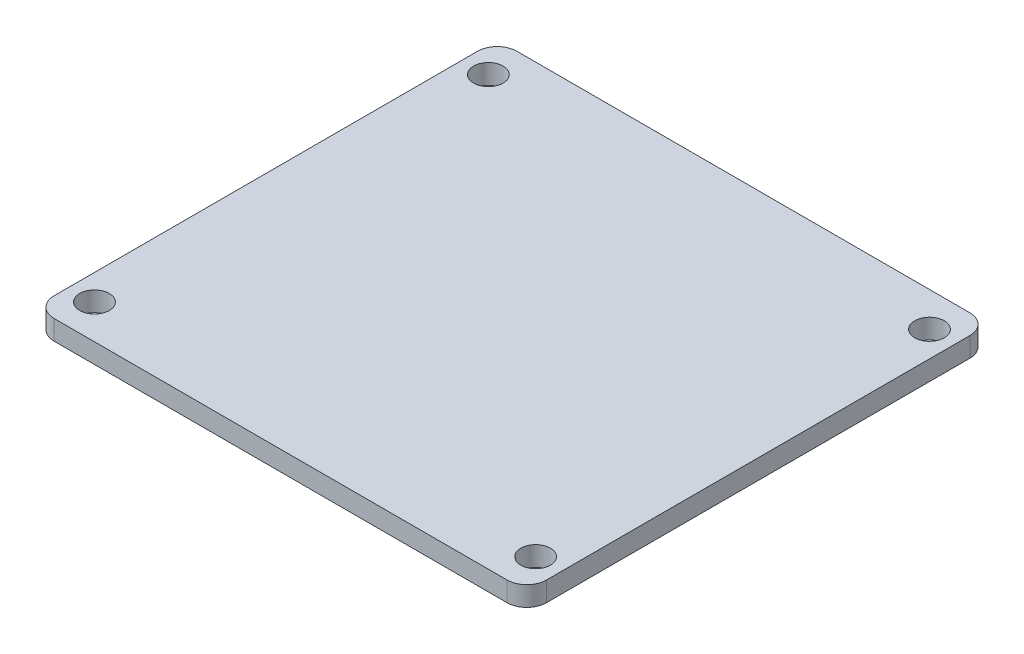
ISO-10303-21;
HEADER;
FILE_DESCRIPTION(('STEP AP214'),'2;1');
FILE_NAME('part.step','',(''),(''),'','','');
FILE_SCHEMA(('AUTOMOTIVE_DESIGN { 1 0 10303 214 1 1 1 1 }'));
ENDSEC;
DATA;
#1=APPLICATION_CONTEXT('core data for automotive mechanical design processes');
#2=APPLICATION_PROTOCOL_DEFINITION('international standard','automotive_design',2000,#1);
#3=PRODUCT_CONTEXT('',#1,'mechanical');
#4=PRODUCT('Part','Part','',(#3));
#5=PRODUCT_RELATED_PRODUCT_CATEGORY('part','',(#4));
#6=PRODUCT_DEFINITION_FORMATION('','',#4);
#7=PRODUCT_DEFINITION_CONTEXT('part definition',#1,'design');
#8=PRODUCT_DEFINITION('design','',#6,#7);
#9=PRODUCT_DEFINITION_SHAPE('','',#8);
#10=(LENGTH_UNIT() NAMED_UNIT(*) SI_UNIT(.MILLI.,.METRE.));
#11=(NAMED_UNIT(*) PLANE_ANGLE_UNIT() SI_UNIT($,.RADIAN.));
#12=(NAMED_UNIT(*) SI_UNIT($,.STERADIAN.) SOLID_ANGLE_UNIT());
#13=UNCERTAINTY_MEASURE_WITH_UNIT(LENGTH_MEASURE(1.E-05),#10,'distance_accuracy_value','');
#14=(GEOMETRIC_REPRESENTATION_CONTEXT(3) GLOBAL_UNCERTAINTY_ASSIGNED_CONTEXT((#13)) GLOBAL_UNIT_ASSIGNED_CONTEXT((#10,
#11,#12)) REPRESENTATION_CONTEXT('',''));
#15=CARTESIAN_POINT('',(0.,0.,0.));
#16=DIRECTION('',(0.,0.,1.));
#17=DIRECTION('',(1.,0.,0.));
#18=AXIS2_PLACEMENT_3D('',#15,#16,#17);
#19=CARTESIAN_POINT('',(0.,2.,0.));
#20=DIRECTION('',(0.,1.,0.));
#21=DIRECTION('',(0.,0.,1.));
#22=AXIS2_PLACEMENT_3D('',#19,#20,#21);
#23=PLANE('',#22);
#24=CARTESIAN_POINT('',(22.4,2.,20.));
#25=DIRECTION('',(0.,1.,0.));
#26=DIRECTION('',(0.,0.,1.));
#27=AXIS2_PLACEMENT_3D('',#24,#25,#26);
#28=CIRCLE('',#27,1.5);
#29=CARTESIAN_POINT('',(22.4,2.,21.5));
#30=VERTEX_POINT('',#29);
#31=EDGE_CURVE('E182',#30,#30,#28,.T.);
#32=ORIENTED_EDGE('',*,*,#31,.F.);
#33=EDGE_LOOP('',(#32));
#34=FACE_BOUND('',#33,.T.);
#35=CARTESIAN_POINT('',(-22.4,2.,-20.));
#36=DIRECTION('',(0.,1.,0.));
#37=DIRECTION('',(0.,0.,1.));
#38=AXIS2_PLACEMENT_3D('',#35,#36,#37);
#39=CIRCLE('',#38,1.5);
#40=CARTESIAN_POINT('',(-22.4,2.,-18.5));
#41=VERTEX_POINT('',#40);
#42=EDGE_CURVE('E165',#41,#41,#39,.T.);
#43=ORIENTED_EDGE('',*,*,#42,.F.);
#44=EDGE_LOOP('',(#43));
#45=FACE_BOUND('',#44,.T.);
#46=DIRECTION('',(0.,0.,1.));
#47=VECTOR('',#46,1.);
#48=CARTESIAN_POINT('',(-25.,2.,-23.5));
#49=LINE('',#48,#47);
#50=CARTESIAN_POINT('',(-25.,2.,-21.5));
#51=VERTEX_POINT('',#50);
#52=CARTESIAN_POINT('',(-25.,2.,21.5));
#53=VERTEX_POINT('',#52);
#54=EDGE_CURVE('E172',#51,#53,#49,.T.);
#55=ORIENTED_EDGE('',*,*,#54,.T.);
#56=CARTESIAN_POINT('',(-23.,2.,21.5));
#57=DIRECTION('',(0.,1.,0.));
#58=DIRECTION('',(0.,0.,1.));
#59=AXIS2_PLACEMENT_3D('',#56,#57,#58);
#60=CIRCLE('',#59,2.);
#61=CARTESIAN_POINT('',(-23.,2.,23.5));
#62=VERTEX_POINT('',#61);
#63=EDGE_CURVE('E149',#53,#62,#60,.T.);
#64=ORIENTED_EDGE('',*,*,#63,.T.);
#65=DIRECTION('',(1.,0.,0.));
#66=VECTOR('',#65,1.);
#67=CARTESIAN_POINT('',(-25.,2.,23.5));
#68=LINE('',#67,#66);
#69=CARTESIAN_POINT('',(23.,2.,23.5));
#70=VERTEX_POINT('',#69);
#71=EDGE_CURVE('E120',#62,#70,#68,.T.);
#72=ORIENTED_EDGE('',*,*,#71,.T.);
#73=CARTESIAN_POINT('',(23.,2.,21.5));
#74=DIRECTION('',(0.,1.,0.));
#75=DIRECTION('',(0.,0.,1.));
#76=AXIS2_PLACEMENT_3D('',#73,#74,#75);
#77=CIRCLE('',#76,2.);
#78=CARTESIAN_POINT('',(25.,2.,21.5));
#79=VERTEX_POINT('',#78);
#80=EDGE_CURVE('E144',#70,#79,#77,.T.);
#81=ORIENTED_EDGE('',*,*,#80,.T.);
#82=DIRECTION('',(0.,0.,-1.));
#83=VECTOR('',#82,1.);
#84=CARTESIAN_POINT('',(25.,2.,-23.5));
#85=LINE('',#84,#83);
#86=CARTESIAN_POINT('',(25.,2.,-21.5));
#87=VERTEX_POINT('',#86);
#88=EDGE_CURVE('E127',#79,#87,#85,.T.);
#89=ORIENTED_EDGE('',*,*,#88,.T.);
#90=CARTESIAN_POINT('',(23.,2.,-21.5));
#91=DIRECTION('',(0.,1.,0.));
#92=DIRECTION('',(0.,0.,1.));
#93=AXIS2_PLACEMENT_3D('',#90,#91,#92);
#94=CIRCLE('',#93,2.);
#95=CARTESIAN_POINT('',(23.,2.,-23.5));
#96=VERTEX_POINT('',#95);
#97=EDGE_CURVE('E56',#87,#96,#94,.T.);
#98=ORIENTED_EDGE('',*,*,#97,.T.);
#99=DIRECTION('',(-1.,0.,0.));
#100=VECTOR('',#99,1.);
#101=CARTESIAN_POINT('',(-25.,2.,-23.5));
#102=LINE('',#101,#100);
#103=CARTESIAN_POINT('',(-23.,2.,-23.5));
#104=VERTEX_POINT('',#103);
#105=EDGE_CURVE('E130',#96,#104,#102,.T.);
#106=ORIENTED_EDGE('',*,*,#105,.T.);
#107=CARTESIAN_POINT('',(-23.,2.,-21.5));
#108=DIRECTION('',(0.,1.,0.));
#109=DIRECTION('',(0.,0.,1.));
#110=AXIS2_PLACEMENT_3D('',#107,#108,#109);
#111=CIRCLE('',#110,2.);
#112=EDGE_CURVE('E147',#104,#51,#111,.T.);
#113=ORIENTED_EDGE('',*,*,#112,.T.);
#114=EDGE_LOOP('',(#55,#64,#72,#81,#89,#98,#106,#113));
#115=FACE_BOUND('',#114,.T.);
#116=CARTESIAN_POINT('',(22.4,2.,-20.));
#117=DIRECTION('',(0.,1.,0.));
#118=DIRECTION('',(0.,0.,-1.));
#119=AXIS2_PLACEMENT_3D('',#116,#117,#118);
#120=CIRCLE('',#119,1.5);
#121=CARTESIAN_POINT('',(22.4,2.,-21.5));
#122=VERTEX_POINT('',#121);
#123=EDGE_CURVE('E177',#122,#122,#120,.T.);
#124=ORIENTED_EDGE('',*,*,#123,.F.);
#125=EDGE_LOOP('',(#124));
#126=FACE_BOUND('',#125,.T.);
#127=CARTESIAN_POINT('',(-22.4,2.,20.));
#128=DIRECTION('',(0.,1.,0.));
#129=DIRECTION('',(0.,0.,-1.));
#130=AXIS2_PLACEMENT_3D('',#127,#128,#129);
#131=CIRCLE('',#130,1.5);
#132=CARTESIAN_POINT('',(-22.4,2.,18.5));
#133=VERTEX_POINT('',#132);
#134=EDGE_CURVE('E188',#133,#133,#131,.T.);
#135=ORIENTED_EDGE('',*,*,#134,.F.);
#136=EDGE_LOOP('',(#135));
#137=FACE_BOUND('',#136,.T.);
#138=ADVANCED_FACE('F34',(#34,#45,#115,#126,#137),#23,.T.);
#139=CARTESIAN_POINT('',(0.,0.,0.));
#140=DIRECTION('',(0.,1.,0.));
#141=DIRECTION('',(0.,0.,1.));
#142=AXIS2_PLACEMENT_3D('',#139,#140,#141);
#143=PLANE('',#142);
#144=DIRECTION('',(1.,0.,0.));
#145=VECTOR('',#144,1.);
#146=CARTESIAN_POINT('',(-25.,0.,23.5));
#147=LINE('',#146,#145);
#148=CARTESIAN_POINT('',(-23.,0.,23.5));
#149=VERTEX_POINT('',#148);
#150=CARTESIAN_POINT('',(23.,0.,23.5));
#151=VERTEX_POINT('',#150);
#152=EDGE_CURVE('E117',#149,#151,#147,.T.);
#153=ORIENTED_EDGE('',*,*,#152,.F.);
#154=CARTESIAN_POINT('',(-23.,0.,21.5));
#155=DIRECTION('',(0.,1.,0.));
#156=DIRECTION('',(0.,0.,1.));
#157=AXIS2_PLACEMENT_3D('',#154,#155,#156);
#158=CIRCLE('',#157,2.);
#159=CARTESIAN_POINT('',(-25.,0.,21.5));
#160=VERTEX_POINT('',#159);
#161=EDGE_CURVE('E100',#149,#160,#158,.F.);
#162=ORIENTED_EDGE('',*,*,#161,.T.);
#163=DIRECTION('',(0.,0.,1.));
#164=VECTOR('',#163,1.);
#165=CARTESIAN_POINT('',(-25.,0.,-23.5));
#166=LINE('',#165,#164);
#167=CARTESIAN_POINT('',(-25.,0.,-21.5));
#168=VERTEX_POINT('',#167);
#169=EDGE_CURVE('E128',#168,#160,#166,.T.);
#170=ORIENTED_EDGE('',*,*,#169,.F.);
#171=CARTESIAN_POINT('',(-23.,0.,-21.5));
#172=DIRECTION('',(0.,1.,0.));
#173=DIRECTION('',(0.,0.,1.));
#174=AXIS2_PLACEMENT_3D('',#171,#172,#173);
#175=CIRCLE('',#174,2.);
#176=CARTESIAN_POINT('',(-23.,0.,-23.5));
#177=VERTEX_POINT('',#176);
#178=EDGE_CURVE('E111',#168,#177,#175,.F.);
#179=ORIENTED_EDGE('',*,*,#178,.T.);
#180=DIRECTION('',(-1.,0.,0.));
#181=VECTOR('',#180,1.);
#182=CARTESIAN_POINT('',(-25.,0.,-23.5));
#183=LINE('',#182,#181);
#184=CARTESIAN_POINT('',(23.,0.,-23.5));
#185=VERTEX_POINT('',#184);
#186=EDGE_CURVE('E132',#185,#177,#183,.T.);
#187=ORIENTED_EDGE('',*,*,#186,.F.);
#188=CARTESIAN_POINT('',(23.,0.,-21.5));
#189=DIRECTION('',(0.,1.,0.));
#190=DIRECTION('',(0.,0.,1.));
#191=AXIS2_PLACEMENT_3D('',#188,#189,#190);
#192=CIRCLE('',#191,2.);
#193=CARTESIAN_POINT('',(25.,0.,-21.5));
#194=VERTEX_POINT('',#193);
#195=EDGE_CURVE('E138',#185,#194,#192,.F.);
#196=ORIENTED_EDGE('',*,*,#195,.T.);
#197=DIRECTION('',(0.,0.,-1.));
#198=VECTOR('',#197,1.);
#199=CARTESIAN_POINT('',(25.,0.,-23.5));
#200=LINE('',#199,#198);
#201=CARTESIAN_POINT('',(25.,0.,21.5));
#202=VERTEX_POINT('',#201);
#203=EDGE_CURVE('E160',#202,#194,#200,.T.);
#204=ORIENTED_EDGE('',*,*,#203,.F.);
#205=CARTESIAN_POINT('',(23.,0.,21.5));
#206=DIRECTION('',(0.,1.,0.));
#207=DIRECTION('',(0.,0.,1.));
#208=AXIS2_PLACEMENT_3D('',#205,#206,#207);
#209=CIRCLE('',#208,2.);
#210=EDGE_CURVE('E121',#202,#151,#209,.F.);
#211=ORIENTED_EDGE('',*,*,#210,.T.);
#212=EDGE_LOOP('',(#153,#162,#170,#179,#187,#196,#204,#211));
#213=FACE_BOUND('',#212,.T.);
#214=CARTESIAN_POINT('',(-22.4,0.,-20.));
#215=DIRECTION('',(0.,1.,0.));
#216=DIRECTION('',(0.,0.,1.));
#217=AXIS2_PLACEMENT_3D('',#214,#215,#216);
#218=CIRCLE('',#217,1.5);
#219=CARTESIAN_POINT('',(-22.4,0.,-18.5));
#220=VERTEX_POINT('',#219);
#221=EDGE_CURVE('E168',#220,#220,#218,.T.);
#222=ORIENTED_EDGE('',*,*,#221,.T.);
#223=EDGE_LOOP('',(#222));
#224=FACE_BOUND('',#223,.T.);
#225=CARTESIAN_POINT('',(22.4,0.,-20.));
#226=DIRECTION('',(0.,1.,0.));
#227=DIRECTION('',(0.,0.,-1.));
#228=AXIS2_PLACEMENT_3D('',#225,#226,#227);
#229=CIRCLE('',#228,1.5);
#230=CARTESIAN_POINT('',(22.4,0.,-21.5));
#231=VERTEX_POINT('',#230);
#232=EDGE_CURVE('E179',#231,#231,#229,.T.);
#233=ORIENTED_EDGE('',*,*,#232,.T.);
#234=EDGE_LOOP('',(#233));
#235=FACE_BOUND('',#234,.T.);
#236=CARTESIAN_POINT('',(22.4,0.,20.));
#237=DIRECTION('',(0.,1.,0.));
#238=DIRECTION('',(0.,0.,1.));
#239=AXIS2_PLACEMENT_3D('',#236,#237,#238);
#240=CIRCLE('',#239,1.5);
#241=CARTESIAN_POINT('',(22.4,0.,21.5));
#242=VERTEX_POINT('',#241);
#243=EDGE_CURVE('E185',#242,#242,#240,.T.);
#244=ORIENTED_EDGE('',*,*,#243,.T.);
#245=EDGE_LOOP('',(#244));
#246=FACE_BOUND('',#245,.T.);
#247=CARTESIAN_POINT('',(-22.4,0.,20.));
#248=DIRECTION('',(0.,1.,0.));
#249=DIRECTION('',(0.,0.,-1.));
#250=AXIS2_PLACEMENT_3D('',#247,#248,#249);
#251=CIRCLE('',#250,1.5);
#252=CARTESIAN_POINT('',(-22.4,0.,18.5));
#253=VERTEX_POINT('',#252);
#254=EDGE_CURVE('E191',#253,#253,#251,.T.);
#255=ORIENTED_EDGE('',*,*,#254,.T.);
#256=EDGE_LOOP('',(#255));
#257=FACE_BOUND('',#256,.T.);
#258=ADVANCED_FACE('F124',(#213,#224,#235,#246,#257),#143,.F.);
#259=CARTESIAN_POINT('',(25.,2.,-23.5));
#260=DIRECTION('',(-1.,0.,0.));
#261=DIRECTION('',(0.,0.,1.));
#262=AXIS2_PLACEMENT_3D('',#259,#260,#261);
#263=PLANE('',#262);
#264=ORIENTED_EDGE('',*,*,#203,.T.);
#265=DIRECTION('',(0.,-1.,0.));
#266=VECTOR('',#265,1.);
#267=CARTESIAN_POINT('',(25.,2.,-21.5));
#268=LINE('',#267,#266);
#269=EDGE_CURVE('E11',#194,#87,#268,.F.);
#270=ORIENTED_EDGE('',*,*,#269,.T.);
#271=ORIENTED_EDGE('',*,*,#88,.F.);
#272=DIRECTION('',(0.,-1.,0.));
#273=VECTOR('',#272,1.);
#274=CARTESIAN_POINT('',(25.,2.,21.5));
#275=LINE('',#274,#273);
#276=EDGE_CURVE('E42',#79,#202,#275,.T.);
#277=ORIENTED_EDGE('',*,*,#276,.T.);
#278=EDGE_LOOP('',(#264,#270,#271,#277));
#279=FACE_BOUND('',#278,.T.);
#280=ADVANCED_FACE('F159',(#279),#263,.F.);
#281=CARTESIAN_POINT('',(-25.,2.,-23.5));
#282=DIRECTION('',(0.,0.,1.));
#283=DIRECTION('',(1.,0.,0.));
#284=AXIS2_PLACEMENT_3D('',#281,#282,#283);
#285=PLANE('',#284);
#286=ORIENTED_EDGE('',*,*,#186,.T.);
#287=DIRECTION('',(0.,-1.,0.));
#288=VECTOR('',#287,1.);
#289=CARTESIAN_POINT('',(-23.,2.,-23.5));
#290=LINE('',#289,#288);
#291=EDGE_CURVE('E49',#177,#104,#290,.F.);
#292=ORIENTED_EDGE('',*,*,#291,.T.);
#293=ORIENTED_EDGE('',*,*,#105,.F.);
#294=DIRECTION('',(0.,-1.,0.));
#295=VECTOR('',#294,1.);
#296=CARTESIAN_POINT('',(23.,2.,-23.5));
#297=LINE('',#296,#295);
#298=EDGE_CURVE('E151',#96,#185,#297,.T.);
#299=ORIENTED_EDGE('',*,*,#298,.T.);
#300=EDGE_LOOP('',(#286,#292,#293,#299));
#301=FACE_BOUND('',#300,.T.);
#302=ADVANCED_FACE('F218',(#301),#285,.F.);
#303=CARTESIAN_POINT('',(-25.,2.,-23.5));
#304=DIRECTION('',(1.,0.,0.));
#305=DIRECTION('',(0.,0.,-1.));
#306=AXIS2_PLACEMENT_3D('',#303,#304,#305);
#307=PLANE('',#306);
#308=ORIENTED_EDGE('',*,*,#169,.T.);
#309=DIRECTION('',(0.,-1.,0.));
#310=VECTOR('',#309,1.);
#311=CARTESIAN_POINT('',(-25.,2.,21.5));
#312=LINE('',#311,#310);
#313=EDGE_CURVE('E105',#160,#53,#312,.F.);
#314=ORIENTED_EDGE('',*,*,#313,.T.);
#315=ORIENTED_EDGE('',*,*,#54,.F.);
#316=DIRECTION('',(0.,-1.,0.));
#317=VECTOR('',#316,1.);
#318=CARTESIAN_POINT('',(-25.,2.,-21.5));
#319=LINE('',#318,#317);
#320=EDGE_CURVE('E110',#51,#168,#319,.T.);
#321=ORIENTED_EDGE('',*,*,#320,.T.);
#322=EDGE_LOOP('',(#308,#314,#315,#321));
#323=FACE_BOUND('',#322,.T.);
#324=ADVANCED_FACE('F215',(#323),#307,.F.);
#325=CARTESIAN_POINT('',(-25.,2.,23.5));
#326=DIRECTION('',(0.,0.,-1.));
#327=DIRECTION('',(-1.,0.,0.));
#328=AXIS2_PLACEMENT_3D('',#325,#326,#327);
#329=PLANE('',#328);
#330=ORIENTED_EDGE('',*,*,#71,.F.);
#331=DIRECTION('',(0.,-1.,0.));
#332=VECTOR('',#331,1.);
#333=CARTESIAN_POINT('',(-23.,2.,23.5));
#334=LINE('',#333,#332);
#335=EDGE_CURVE('E104',#62,#149,#334,.T.);
#336=ORIENTED_EDGE('',*,*,#335,.T.);
#337=ORIENTED_EDGE('',*,*,#152,.T.);
#338=DIRECTION('',(0.,-1.,0.));
#339=VECTOR('',#338,1.);
#340=CARTESIAN_POINT('',(23.,2.,23.5));
#341=LINE('',#340,#339);
#342=EDGE_CURVE('E122',#151,#70,#341,.F.);
#343=ORIENTED_EDGE('',*,*,#342,.T.);
#344=EDGE_LOOP('',(#330,#336,#337,#343));
#345=FACE_BOUND('',#344,.T.);
#346=ADVANCED_FACE('F116',(#345),#329,.F.);
#347=CARTESIAN_POINT('',(-22.4,2.,-20.));
#348=DIRECTION('',(0.,-1.,0.));
#349=DIRECTION('',(0.,0.,-1.));
#350=AXIS2_PLACEMENT_3D('',#347,#348,#349);
#351=CYLINDRICAL_SURFACE('',#350,1.5);
#352=ORIENTED_EDGE('',*,*,#42,.T.);
#353=EDGE_LOOP('',(#352));
#354=FACE_BOUND('',#353,.T.);
#355=ORIENTED_EDGE('',*,*,#221,.F.);
#356=EDGE_LOOP('',(#355));
#357=FACE_BOUND('',#356,.T.);
#358=ADVANCED_FACE('F210',(#354,#357),#351,.F.);
#359=CARTESIAN_POINT('',(22.4,2.,-20.));
#360=DIRECTION('',(0.,-1.,0.));
#361=DIRECTION('',(0.,0.,-1.));
#362=AXIS2_PLACEMENT_3D('',#359,#360,#361);
#363=CYLINDRICAL_SURFACE('',#362,1.5);
#364=ORIENTED_EDGE('',*,*,#123,.T.);
#365=EDGE_LOOP('',(#364));
#366=FACE_BOUND('',#365,.T.);
#367=ORIENTED_EDGE('',*,*,#232,.F.);
#368=EDGE_LOOP('',(#367));
#369=FACE_BOUND('',#368,.T.);
#370=ADVANCED_FACE('F242',(#366,#369),#363,.F.);
#371=CARTESIAN_POINT('',(22.4,2.,20.));
#372=DIRECTION('',(0.,-1.,0.));
#373=DIRECTION('',(0.,0.,-1.));
#374=AXIS2_PLACEMENT_3D('',#371,#372,#373);
#375=CYLINDRICAL_SURFACE('',#374,1.5);
#376=ORIENTED_EDGE('',*,*,#31,.T.);
#377=EDGE_LOOP('',(#376));
#378=FACE_BOUND('',#377,.T.);
#379=ORIENTED_EDGE('',*,*,#243,.F.);
#380=EDGE_LOOP('',(#379));
#381=FACE_BOUND('',#380,.T.);
#382=ADVANCED_FACE('F245',(#378,#381),#375,.F.);
#383=CARTESIAN_POINT('',(-22.4,2.,20.));
#384=DIRECTION('',(0.,-1.,0.));
#385=DIRECTION('',(0.,0.,-1.));
#386=AXIS2_PLACEMENT_3D('',#383,#384,#385);
#387=CYLINDRICAL_SURFACE('',#386,1.5);
#388=ORIENTED_EDGE('',*,*,#134,.T.);
#389=EDGE_LOOP('',(#388));
#390=FACE_BOUND('',#389,.T.);
#391=ORIENTED_EDGE('',*,*,#254,.F.);
#392=EDGE_LOOP('',(#391));
#393=FACE_BOUND('',#392,.T.);
#394=ADVANCED_FACE('F197',(#390,#393),#387,.F.);
#395=CARTESIAN_POINT('',(-23.,2.,21.5));
#396=DIRECTION('',(0.,-1.,0.));
#397=DIRECTION('',(0.,0.,-1.));
#398=AXIS2_PLACEMENT_3D('',#395,#396,#397);
#399=CYLINDRICAL_SURFACE('',#398,2.);
#400=ORIENTED_EDGE('',*,*,#63,.F.);
#401=ORIENTED_EDGE('',*,*,#313,.F.);
#402=ORIENTED_EDGE('',*,*,#161,.F.);
#403=ORIENTED_EDGE('',*,*,#335,.F.);
#404=EDGE_LOOP('',(#400,#401,#402,#403));
#405=FACE_BOUND('',#404,.T.);
#406=ADVANCED_FACE('F103',(#405),#399,.T.);
#407=CARTESIAN_POINT('',(-23.,2.,-21.5));
#408=DIRECTION('',(0.,-1.,0.));
#409=DIRECTION('',(0.,0.,-1.));
#410=AXIS2_PLACEMENT_3D('',#407,#408,#409);
#411=CYLINDRICAL_SURFACE('',#410,2.);
#412=ORIENTED_EDGE('',*,*,#112,.F.);
#413=ORIENTED_EDGE('',*,*,#291,.F.);
#414=ORIENTED_EDGE('',*,*,#178,.F.);
#415=ORIENTED_EDGE('',*,*,#320,.F.);
#416=EDGE_LOOP('',(#412,#413,#414,#415));
#417=FACE_BOUND('',#416,.T.);
#418=ADVANCED_FACE('F226',(#417),#411,.T.);
#419=CARTESIAN_POINT('',(23.,2.,-21.5));
#420=DIRECTION('',(0.,-1.,0.));
#421=DIRECTION('',(0.,0.,-1.));
#422=AXIS2_PLACEMENT_3D('',#419,#420,#421);
#423=CYLINDRICAL_SURFACE('',#422,2.);
#424=ORIENTED_EDGE('',*,*,#97,.F.);
#425=ORIENTED_EDGE('',*,*,#269,.F.);
#426=ORIENTED_EDGE('',*,*,#195,.F.);
#427=ORIENTED_EDGE('',*,*,#298,.F.);
#428=EDGE_LOOP('',(#424,#425,#426,#427));
#429=FACE_BOUND('',#428,.T.);
#430=ADVANCED_FACE('F228',(#429),#423,.T.);
#431=CARTESIAN_POINT('',(23.,2.,21.5));
#432=DIRECTION('',(0.,-1.,0.));
#433=DIRECTION('',(0.,0.,-1.));
#434=AXIS2_PLACEMENT_3D('',#431,#432,#433);
#435=CYLINDRICAL_SURFACE('',#434,2.);
#436=ORIENTED_EDGE('',*,*,#80,.F.);
#437=ORIENTED_EDGE('',*,*,#342,.F.);
#438=ORIENTED_EDGE('',*,*,#210,.F.);
#439=ORIENTED_EDGE('',*,*,#276,.F.);
#440=EDGE_LOOP('',(#436,#437,#438,#439));
#441=FACE_BOUND('',#440,.T.);
#442=ADVANCED_FACE('F36',(#441),#435,.T.);
#443=CLOSED_SHELL('',(#138,#258,#280,#302,#324,#346,#358,#370,#382,#394,#406,#418,#430,#442));
#444=MANIFOLD_SOLID_BREP('B2',#443);
#445=ADVANCED_BREP_SHAPE_REPRESENTATION('',(#18,#444),#14);
#446=SHAPE_DEFINITION_REPRESENTATION(#9,#445);
ENDSEC;
END-ISO-10303-21;
